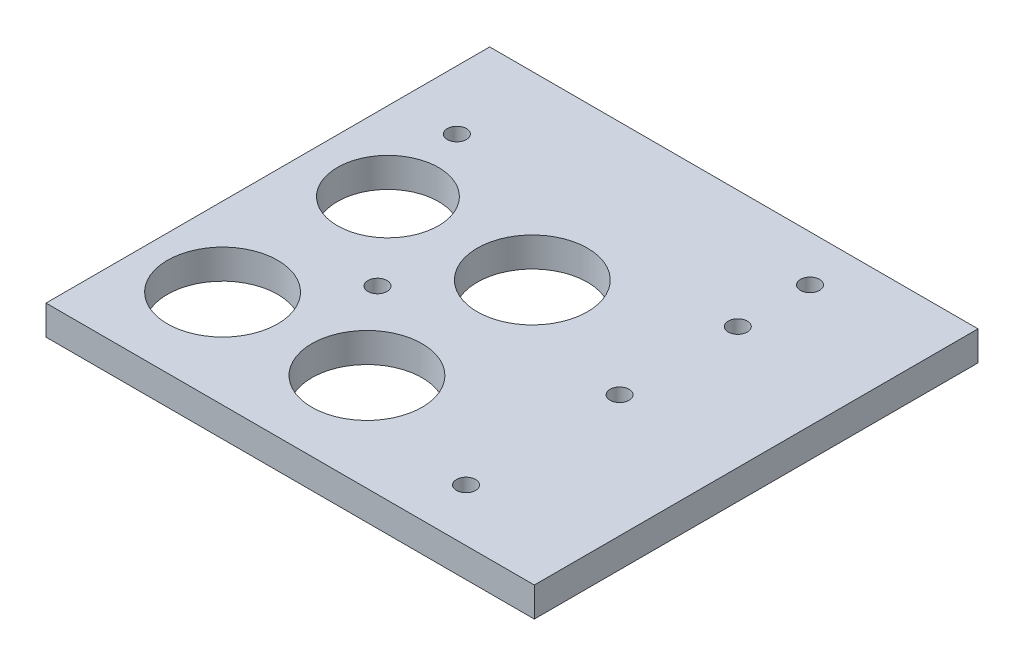
ISO-10303-21;
HEADER;
FILE_DESCRIPTION(('STEP AP214'),'2;1');
FILE_NAME('part.step','',(''),(''),'','','');
FILE_SCHEMA(('AUTOMOTIVE_DESIGN { 1 0 10303 214 1 1 1 1 }'));
ENDSEC;
DATA;
#1=APPLICATION_CONTEXT('core data for automotive mechanical design processes');
#2=APPLICATION_PROTOCOL_DEFINITION('international standard','automotive_design',2000,#1);
#3=PRODUCT_CONTEXT('',#1,'mechanical');
#4=PRODUCT('Part','Part','',(#3));
#5=PRODUCT_RELATED_PRODUCT_CATEGORY('part','',(#4));
#6=PRODUCT_DEFINITION_FORMATION('','',#4);
#7=PRODUCT_DEFINITION_CONTEXT('part definition',#1,'design');
#8=PRODUCT_DEFINITION('design','',#6,#7);
#9=PRODUCT_DEFINITION_SHAPE('','',#8);
#10=(LENGTH_UNIT() NAMED_UNIT(*) SI_UNIT(.MILLI.,.METRE.));
#11=(NAMED_UNIT(*) PLANE_ANGLE_UNIT() SI_UNIT($,.RADIAN.));
#12=(NAMED_UNIT(*) SI_UNIT($,.STERADIAN.) SOLID_ANGLE_UNIT());
#13=UNCERTAINTY_MEASURE_WITH_UNIT(LENGTH_MEASURE(1.E-05),#10,'distance_accuracy_value','');
#14=(GEOMETRIC_REPRESENTATION_CONTEXT(3) GLOBAL_UNCERTAINTY_ASSIGNED_CONTEXT((#13)) GLOBAL_UNIT_ASSIGNED_CONTEXT((#10,
#11,#12)) REPRESENTATION_CONTEXT('',''));
#15=CARTESIAN_POINT('',(0.,0.,0.));
#16=DIRECTION('',(0.,0.,1.));
#17=DIRECTION('',(1.,0.,0.));
#18=AXIS2_PLACEMENT_3D('',#15,#16,#17);
#19=CARTESIAN_POINT('',(0.,5.715,0.));
#20=DIRECTION('',(0.,1.,0.));
#21=DIRECTION('',(0.,0.,1.));
#22=AXIS2_PLACEMENT_3D('',#19,#20,#21);
#23=PLANE('',#22);
#24=CARTESIAN_POINT('',(41.656,5.715,-42.037));
#25=DIRECTION('',(0.,1.,0.));
#26=DIRECTION('',(0.,0.,1.));
#27=AXIS2_PLACEMENT_3D('',#24,#25,#26);
#28=CIRCLE('',#27,1.85);
#29=CARTESIAN_POINT('',(41.656,5.715,-40.187));
#30=VERTEX_POINT('',#29);
#31=EDGE_CURVE('E132',#30,#30,#28,.T.);
#32=ORIENTED_EDGE('',*,*,#31,.F.);
#33=EDGE_LOOP('',(#32));
#34=FACE_BOUND('',#33,.T.);
#35=CARTESIAN_POINT('',(41.91,5.715,24.765));
#36=DIRECTION('',(0.,1.,0.));
#37=DIRECTION('',(0.,0.,1.));
#38=AXIS2_PLACEMENT_3D('',#35,#36,#37);
#39=CIRCLE('',#38,1.85);
#40=CARTESIAN_POINT('',(41.91,5.715,26.615));
#41=VERTEX_POINT('',#40);
#42=EDGE_CURVE('E121',#41,#41,#39,.T.);
#43=ORIENTED_EDGE('',*,*,#42,.F.);
#44=EDGE_LOOP('',(#43));
#45=FACE_BOUND('',#44,.T.);
#46=CARTESIAN_POINT('',(-17.78,5.715,-33.147));
#47=DIRECTION('',(0.,1.,0.));
#48=DIRECTION('',(0.,0.,1.));
#49=AXIS2_PLACEMENT_3D('',#46,#47,#48);
#50=CIRCLE('',#49,1.85);
#51=CARTESIAN_POINT('',(-17.78,5.715,-31.297));
#52=VERTEX_POINT('',#51);
#53=EDGE_CURVE('E120',#52,#52,#50,.T.);
#54=ORIENTED_EDGE('',*,*,#53,.F.);
#55=EDGE_LOOP('',(#54));
#56=FACE_BOUND('',#55,.T.);
#57=CARTESIAN_POINT('',(41.656,5.715,-5.207));
#58=DIRECTION('',(0.,1.,0.));
#59=DIRECTION('',(0.,0.,1.));
#60=AXIS2_PLACEMENT_3D('',#57,#58,#59);
#61=CIRCLE('',#60,1.85);
#62=CARTESIAN_POINT('',(41.656,5.715,-3.35700000000001));
#63=VERTEX_POINT('',#62);
#64=EDGE_CURVE('E117',#63,#63,#61,.T.);
#65=ORIENTED_EDGE('',*,*,#64,.F.);
#66=EDGE_LOOP('',(#65));
#67=FACE_BOUND('',#66,.T.);
#68=CARTESIAN_POINT('',(41.656,5.715,-28.067));
#69=DIRECTION('',(0.,1.,0.));
#70=DIRECTION('',(0.,0.,1.));
#71=AXIS2_PLACEMENT_3D('',#68,#69,#70);
#72=CIRCLE('',#71,1.85);
#73=CARTESIAN_POINT('',(41.656,5.715,-26.217));
#74=VERTEX_POINT('',#73);
#75=EDGE_CURVE('E114',#74,#74,#72,.T.);
#76=ORIENTED_EDGE('',*,*,#75,.F.);
#77=EDGE_LOOP('',(#76));
#78=FACE_BOUND('',#77,.T.);
#79=CARTESIAN_POINT('',(0.,5.715,0.));
#80=DIRECTION('',(0.,1.,0.));
#81=DIRECTION('',(0.,0.,1.));
#82=AXIS2_PLACEMENT_3D('',#79,#80,#81);
#83=CIRCLE('',#82,1.85);
#84=CARTESIAN_POINT('',(0.,5.715,1.85));
#85=VERTEX_POINT('',#84);
#86=EDGE_CURVE('E113',#85,#85,#83,.T.);
#87=ORIENTED_EDGE('',*,*,#86,.F.);
#88=EDGE_LOOP('',(#87));
#89=FACE_BOUND('',#88,.T.);
#90=CARTESIAN_POINT('',(13.9699999999999,5.715,16.002));
#91=DIRECTION('',(0.,1.,0.));
#92=DIRECTION('',(0.,0.,1.));
#93=AXIS2_PLACEMENT_3D('',#90,#91,#92);
#94=CIRCLE('',#93,10.668);
#95=CARTESIAN_POINT('',(13.9699999999999,5.715,26.67));
#96=VERTEX_POINT('',#95);
#97=EDGE_CURVE('E153',#96,#96,#94,.T.);
#98=ORIENTED_EDGE('',*,*,#97,.F.);
#99=EDGE_LOOP('',(#98));
#100=FACE_BOUND('',#99,.T.);
#101=CARTESIAN_POINT('',(-13.97,5.715,-16.002));
#102=DIRECTION('',(0.,1.,0.));
#103=DIRECTION('',(0.,0.,1.));
#104=AXIS2_PLACEMENT_3D('',#101,#102,#103);
#105=CIRCLE('',#104,9.779);
#106=CARTESIAN_POINT('',(-13.97,5.715,-6.223));
#107=VERTEX_POINT('',#106);
#108=EDGE_CURVE('E104',#107,#107,#105,.T.);
#109=ORIENTED_EDGE('',*,*,#108,.F.);
#110=EDGE_LOOP('',(#109));
#111=FACE_BOUND('',#110,.T.);
#112=DIRECTION('',(0.,0.,-1.));
#113=VECTOR('',#112,1.);
#114=CARTESIAN_POINT('',(65.278,5.715,-50.927));
#115=LINE('',#114,#113);
#116=CARTESIAN_POINT('',(65.278,5.715,34.925));
#117=VERTEX_POINT('',#116);
#118=CARTESIAN_POINT('',(65.278,5.715,-50.927));
#119=VERTEX_POINT('',#118);
#120=EDGE_CURVE('E88',#117,#119,#115,.T.);
#121=ORIENTED_EDGE('',*,*,#120,.T.);
#122=DIRECTION('',(-1.,0.,0.));
#123=VECTOR('',#122,1.);
#124=CARTESIAN_POINT('',(-29.21,5.715,-50.927));
#125=LINE('',#124,#123);
#126=CARTESIAN_POINT('',(-29.21,5.715,-50.927));
#127=VERTEX_POINT('',#126);
#128=EDGE_CURVE('E83',#119,#127,#125,.T.);
#129=ORIENTED_EDGE('',*,*,#128,.T.);
#130=DIRECTION('',(0.,0.,1.));
#131=VECTOR('',#130,1.);
#132=CARTESIAN_POINT('',(-29.21,5.715,-50.927));
#133=LINE('',#132,#131);
#134=CARTESIAN_POINT('',(-29.21,5.715,34.925));
#135=VERTEX_POINT('',#134);
#136=EDGE_CURVE('E86',#127,#135,#133,.T.);
#137=ORIENTED_EDGE('',*,*,#136,.T.);
#138=DIRECTION('',(1.,0.,0.));
#139=VECTOR('',#138,1.);
#140=CARTESIAN_POINT('',(-29.21,5.715,34.925));
#141=LINE('',#140,#139);
#142=EDGE_CURVE('E53',#135,#117,#141,.T.);
#143=ORIENTED_EDGE('',*,*,#142,.T.);
#144=EDGE_LOOP('',(#121,#129,#137,#143));
#145=FACE_BOUND('',#144,.T.);
#146=CARTESIAN_POINT('',(13.9699999999999,5.715,-16.002));
#147=DIRECTION('',(0.,1.,0.));
#148=DIRECTION('',(0.,0.,-1.));
#149=AXIS2_PLACEMENT_3D('',#146,#147,#148);
#150=CIRCLE('',#149,10.668);
#151=CARTESIAN_POINT('',(13.9699999999999,5.715,-26.67));
#152=VERTEX_POINT('',#151);
#153=EDGE_CURVE('E159',#152,#152,#150,.T.);
#154=ORIENTED_EDGE('',*,*,#153,.F.);
#155=EDGE_LOOP('',(#154));
#156=FACE_BOUND('',#155,.T.);
#157=CARTESIAN_POINT('',(-13.97,5.715,16.002));
#158=DIRECTION('',(0.,1.,0.));
#159=DIRECTION('',(0.,0.,-1.));
#160=AXIS2_PLACEMENT_3D('',#157,#158,#159);
#161=CIRCLE('',#160,10.668);
#162=CARTESIAN_POINT('',(-13.97,5.715,5.334));
#163=VERTEX_POINT('',#162);
#164=EDGE_CURVE('E147',#163,#163,#161,.T.);
#165=ORIENTED_EDGE('',*,*,#164,.F.);
#166=EDGE_LOOP('',(#165));
#167=FACE_BOUND('',#166,.T.);
#168=ADVANCED_FACE('F34',(#34,#45,#56,#67,#78,#89,#100,#111,#145,#156,#167),#23,.T.);
#169=CARTESIAN_POINT('',(0.,0.,0.));
#170=DIRECTION('',(0.,1.,0.));
#171=DIRECTION('',(0.,0.,1.));
#172=AXIS2_PLACEMENT_3D('',#169,#170,#171);
#173=PLANE('',#172);
#174=CARTESIAN_POINT('',(41.656,0.,-42.037));
#175=DIRECTION('',(0.,1.,0.));
#176=DIRECTION('',(0.,0.,1.));
#177=AXIS2_PLACEMENT_3D('',#174,#175,#176);
#178=CIRCLE('',#177,1.84999999999999);
#179=CARTESIAN_POINT('',(41.656,0.,-40.187));
#180=VERTEX_POINT('',#179);
#181=EDGE_CURVE('E38',#180,#180,#178,.T.);
#182=ORIENTED_EDGE('',*,*,#181,.T.);
#183=EDGE_LOOP('',(#182));
#184=FACE_BOUND('',#183,.T.);
#185=CARTESIAN_POINT('',(41.91,0.,24.765));
#186=DIRECTION('',(0.,1.,0.));
#187=DIRECTION('',(0.,0.,1.));
#188=AXIS2_PLACEMENT_3D('',#185,#186,#187);
#189=CIRCLE('',#188,1.84999999999999);
#190=CARTESIAN_POINT('',(41.91,0.,26.615));
#191=VERTEX_POINT('',#190);
#192=EDGE_CURVE('E118',#191,#191,#189,.T.);
#193=ORIENTED_EDGE('',*,*,#192,.T.);
#194=EDGE_LOOP('',(#193));
#195=FACE_BOUND('',#194,.T.);
#196=CARTESIAN_POINT('',(-17.78,0.,-33.147));
#197=DIRECTION('',(0.,1.,0.));
#198=DIRECTION('',(0.,0.,1.));
#199=AXIS2_PLACEMENT_3D('',#196,#197,#198);
#200=CIRCLE('',#199,1.85);
#201=CARTESIAN_POINT('',(-17.78,0.,-31.297));
#202=VERTEX_POINT('',#201);
#203=EDGE_CURVE('E125',#202,#202,#200,.T.);
#204=ORIENTED_EDGE('',*,*,#203,.T.);
#205=EDGE_LOOP('',(#204));
#206=FACE_BOUND('',#205,.T.);
#207=CARTESIAN_POINT('',(41.656,0.,-5.207));
#208=DIRECTION('',(0.,1.,0.));
#209=DIRECTION('',(0.,0.,1.));
#210=AXIS2_PLACEMENT_3D('',#207,#208,#209);
#211=CIRCLE('',#210,1.84999999999999);
#212=CARTESIAN_POINT('',(41.656,0.,-3.35700000000001));
#213=VERTEX_POINT('',#212);
#214=EDGE_CURVE('E115',#213,#213,#211,.T.);
#215=ORIENTED_EDGE('',*,*,#214,.T.);
#216=EDGE_LOOP('',(#215));
#217=FACE_BOUND('',#216,.T.);
#218=CARTESIAN_POINT('',(41.656,0.,-28.067));
#219=DIRECTION('',(0.,1.,0.));
#220=DIRECTION('',(0.,0.,1.));
#221=AXIS2_PLACEMENT_3D('',#218,#219,#220);
#222=CIRCLE('',#221,1.84999999999999);
#223=CARTESIAN_POINT('',(41.656,0.,-26.217));
#224=VERTEX_POINT('',#223);
#225=EDGE_CURVE('E110',#224,#224,#222,.T.);
#226=ORIENTED_EDGE('',*,*,#225,.T.);
#227=EDGE_LOOP('',(#226));
#228=FACE_BOUND('',#227,.T.);
#229=CARTESIAN_POINT('',(0.,0.,0.));
#230=DIRECTION('',(0.,1.,0.));
#231=DIRECTION('',(0.,0.,1.));
#232=AXIS2_PLACEMENT_3D('',#229,#230,#231);
#233=CIRCLE('',#232,1.85);
#234=CARTESIAN_POINT('',(0.,0.,1.85));
#235=VERTEX_POINT('',#234);
#236=EDGE_CURVE('E143',#235,#235,#233,.T.);
#237=ORIENTED_EDGE('',*,*,#236,.T.);
#238=EDGE_LOOP('',(#237));
#239=FACE_BOUND('',#238,.T.);
#240=DIRECTION('',(0.,0.,-1.));
#241=VECTOR('',#240,1.);
#242=CARTESIAN_POINT('',(65.278,0.,-50.927));
#243=LINE('',#242,#241);
#244=CARTESIAN_POINT('',(65.278,0.,34.925));
#245=VERTEX_POINT('',#244);
#246=CARTESIAN_POINT('',(65.278,0.,-50.927));
#247=VERTEX_POINT('',#246);
#248=EDGE_CURVE('E101',#245,#247,#243,.T.);
#249=ORIENTED_EDGE('',*,*,#248,.F.);
#250=DIRECTION('',(1.,0.,0.));
#251=VECTOR('',#250,1.);
#252=CARTESIAN_POINT('',(-29.21,0.,34.925));
#253=LINE('',#252,#251);
#254=CARTESIAN_POINT('',(-29.21,0.,34.925));
#255=VERTEX_POINT('',#254);
#256=EDGE_CURVE('E76',#255,#245,#253,.T.);
#257=ORIENTED_EDGE('',*,*,#256,.F.);
#258=DIRECTION('',(0.,0.,1.));
#259=VECTOR('',#258,1.);
#260=CARTESIAN_POINT('',(-29.21,0.,-50.927));
#261=LINE('',#260,#259);
#262=CARTESIAN_POINT('',(-29.21,0.,-50.927));
#263=VERTEX_POINT('',#262);
#264=EDGE_CURVE('E70',#263,#255,#261,.T.);
#265=ORIENTED_EDGE('',*,*,#264,.F.);
#266=DIRECTION('',(-1.,0.,0.));
#267=VECTOR('',#266,1.);
#268=CARTESIAN_POINT('',(-29.21,0.,-50.927));
#269=LINE('',#268,#267);
#270=EDGE_CURVE('E92',#247,#263,#269,.T.);
#271=ORIENTED_EDGE('',*,*,#270,.F.);
#272=EDGE_LOOP('',(#249,#257,#265,#271));
#273=FACE_BOUND('',#272,.T.);
#274=CARTESIAN_POINT('',(-13.97,0.,-16.002));
#275=DIRECTION('',(0.,1.,0.));
#276=DIRECTION('',(0.,0.,1.));
#277=AXIS2_PLACEMENT_3D('',#274,#275,#276);
#278=CIRCLE('',#277,9.779);
#279=CARTESIAN_POINT('',(-13.97,0.,-6.223));
#280=VERTEX_POINT('',#279);
#281=EDGE_CURVE('E162',#280,#280,#278,.T.);
#282=ORIENTED_EDGE('',*,*,#281,.T.);
#283=EDGE_LOOP('',(#282));
#284=FACE_BOUND('',#283,.T.);
#285=CARTESIAN_POINT('',(13.9699999999999,0.,-16.002));
#286=DIRECTION('',(0.,1.,0.));
#287=DIRECTION('',(0.,0.,-1.));
#288=AXIS2_PLACEMENT_3D('',#285,#286,#287);
#289=CIRCLE('',#288,10.668);
#290=CARTESIAN_POINT('',(13.9699999999999,0.,-26.67));
#291=VERTEX_POINT('',#290);
#292=EDGE_CURVE('E156',#291,#291,#289,.T.);
#293=ORIENTED_EDGE('',*,*,#292,.T.);
#294=EDGE_LOOP('',(#293));
#295=FACE_BOUND('',#294,.T.);
#296=CARTESIAN_POINT('',(13.9699999999999,0.,16.002));
#297=DIRECTION('',(0.,1.,0.));
#298=DIRECTION('',(0.,0.,1.));
#299=AXIS2_PLACEMENT_3D('',#296,#297,#298);
#300=CIRCLE('',#299,10.668);
#301=CARTESIAN_POINT('',(13.9699999999999,0.,26.67));
#302=VERTEX_POINT('',#301);
#303=EDGE_CURVE('E150',#302,#302,#300,.T.);
#304=ORIENTED_EDGE('',*,*,#303,.T.);
#305=EDGE_LOOP('',(#304));
#306=FACE_BOUND('',#305,.T.);
#307=CARTESIAN_POINT('',(-13.97,0.,16.002));
#308=DIRECTION('',(0.,1.,0.));
#309=DIRECTION('',(0.,0.,-1.));
#310=AXIS2_PLACEMENT_3D('',#307,#308,#309);
#311=CIRCLE('',#310,10.668);
#312=CARTESIAN_POINT('',(-13.97,0.,5.334));
#313=VERTEX_POINT('',#312);
#314=EDGE_CURVE('E146',#313,#313,#311,.T.);
#315=ORIENTED_EDGE('',*,*,#314,.T.);
#316=EDGE_LOOP('',(#315));
#317=FACE_BOUND('',#316,.T.);
#318=ADVANCED_FACE('F170',(#184,#195,#206,#217,#228,#239,#273,#284,#295,#306,#317),#173,.F.);
#319=CARTESIAN_POINT('',(65.278,5.715,-50.927));
#320=DIRECTION('',(-1.,0.,0.));
#321=DIRECTION('',(0.,0.,1.));
#322=AXIS2_PLACEMENT_3D('',#319,#320,#321);
#323=PLANE('',#322);
#324=ORIENTED_EDGE('',*,*,#248,.T.);
#325=DIRECTION('',(0.,-1.,0.));
#326=VECTOR('',#325,1.);
#327=CARTESIAN_POINT('',(65.278,5.715,-50.927));
#328=LINE('',#327,#326);
#329=EDGE_CURVE('E11',#119,#247,#328,.T.);
#330=ORIENTED_EDGE('',*,*,#329,.F.);
#331=ORIENTED_EDGE('',*,*,#120,.F.);
#332=DIRECTION('',(0.,-1.,0.));
#333=VECTOR('',#332,1.);
#334=CARTESIAN_POINT('',(65.278,5.715,34.925));
#335=LINE('',#334,#333);
#336=EDGE_CURVE('E97',#117,#245,#335,.T.);
#337=ORIENTED_EDGE('',*,*,#336,.T.);
#338=EDGE_LOOP('',(#324,#330,#331,#337));
#339=FACE_BOUND('',#338,.T.);
#340=ADVANCED_FACE('F36',(#339),#323,.F.);
#341=CARTESIAN_POINT('',(-29.21,5.715,-50.927));
#342=DIRECTION('',(0.,0.,1.));
#343=DIRECTION('',(1.,0.,0.));
#344=AXIS2_PLACEMENT_3D('',#341,#342,#343);
#345=PLANE('',#344);
#346=ORIENTED_EDGE('',*,*,#270,.T.);
#347=DIRECTION('',(0.,-1.,0.));
#348=VECTOR('',#347,1.);
#349=CARTESIAN_POINT('',(-29.21,5.715,-50.927));
#350=LINE('',#349,#348);
#351=EDGE_CURVE('E44',#127,#263,#350,.T.);
#352=ORIENTED_EDGE('',*,*,#351,.F.);
#353=ORIENTED_EDGE('',*,*,#128,.F.);
#354=ORIENTED_EDGE('',*,*,#329,.T.);
#355=EDGE_LOOP('',(#346,#352,#353,#354));
#356=FACE_BOUND('',#355,.T.);
#357=ADVANCED_FACE('F91',(#356),#345,.F.);
#358=CARTESIAN_POINT('',(-29.21,5.715,-50.927));
#359=DIRECTION('',(1.,0.,0.));
#360=DIRECTION('',(0.,0.,-1.));
#361=AXIS2_PLACEMENT_3D('',#358,#359,#360);
#362=PLANE('',#361);
#363=ORIENTED_EDGE('',*,*,#264,.T.);
#364=DIRECTION('',(0.,-1.,0.));
#365=VECTOR('',#364,1.);
#366=CARTESIAN_POINT('',(-29.21,5.715,34.925));
#367=LINE('',#366,#365);
#368=EDGE_CURVE('E93',#135,#255,#367,.T.);
#369=ORIENTED_EDGE('',*,*,#368,.F.);
#370=ORIENTED_EDGE('',*,*,#136,.F.);
#371=ORIENTED_EDGE('',*,*,#351,.T.);
#372=EDGE_LOOP('',(#363,#369,#370,#371));
#373=FACE_BOUND('',#372,.T.);
#374=ADVANCED_FACE('F95',(#373),#362,.F.);
#375=CARTESIAN_POINT('',(-29.21,5.715,34.925));
#376=DIRECTION('',(0.,0.,-1.));
#377=DIRECTION('',(-1.,0.,0.));
#378=AXIS2_PLACEMENT_3D('',#375,#376,#377);
#379=PLANE('',#378);
#380=ORIENTED_EDGE('',*,*,#256,.T.);
#381=ORIENTED_EDGE('',*,*,#336,.F.);
#382=ORIENTED_EDGE('',*,*,#142,.F.);
#383=ORIENTED_EDGE('',*,*,#368,.T.);
#384=EDGE_LOOP('',(#380,#381,#382,#383));
#385=FACE_BOUND('',#384,.T.);
#386=ADVANCED_FACE('F176',(#385),#379,.F.);
#387=CARTESIAN_POINT('',(-13.97,5.715,-16.002));
#388=DIRECTION('',(0.,-1.,0.));
#389=DIRECTION('',(0.,0.,-1.));
#390=AXIS2_PLACEMENT_3D('',#387,#388,#389);
#391=CYLINDRICAL_SURFACE('',#390,9.779);
#392=ORIENTED_EDGE('',*,*,#108,.T.);
#393=EDGE_LOOP('',(#392));
#394=FACE_BOUND('',#393,.T.);
#395=ORIENTED_EDGE('',*,*,#281,.F.);
#396=EDGE_LOOP('',(#395));
#397=FACE_BOUND('',#396,.T.);
#398=ADVANCED_FACE('F173',(#394,#397),#391,.F.);
#399=CARTESIAN_POINT('',(13.9699999999999,5.715,-16.002));
#400=DIRECTION('',(0.,-1.,0.));
#401=DIRECTION('',(0.,0.,-1.));
#402=AXIS2_PLACEMENT_3D('',#399,#400,#401);
#403=CYLINDRICAL_SURFACE('',#402,10.668);
#404=ORIENTED_EDGE('',*,*,#153,.T.);
#405=EDGE_LOOP('',(#404));
#406=FACE_BOUND('',#405,.T.);
#407=ORIENTED_EDGE('',*,*,#292,.F.);
#408=EDGE_LOOP('',(#407));
#409=FACE_BOUND('',#408,.T.);
#410=ADVANCED_FACE('F175',(#406,#409),#403,.F.);
#411=CARTESIAN_POINT('',(13.9699999999999,5.715,16.002));
#412=DIRECTION('',(0.,-1.,0.));
#413=DIRECTION('',(0.,0.,-1.));
#414=AXIS2_PLACEMENT_3D('',#411,#412,#413);
#415=CYLINDRICAL_SURFACE('',#414,10.668);
#416=ORIENTED_EDGE('',*,*,#97,.T.);
#417=EDGE_LOOP('',(#416));
#418=FACE_BOUND('',#417,.T.);
#419=ORIENTED_EDGE('',*,*,#303,.F.);
#420=EDGE_LOOP('',(#419));
#421=FACE_BOUND('',#420,.T.);
#422=ADVANCED_FACE('F183',(#418,#421),#415,.F.);
#423=CARTESIAN_POINT('',(-13.97,5.715,16.002));
#424=DIRECTION('',(0.,-1.,0.));
#425=DIRECTION('',(0.,0.,-1.));
#426=AXIS2_PLACEMENT_3D('',#423,#424,#425);
#427=CYLINDRICAL_SURFACE('',#426,10.668);
#428=ORIENTED_EDGE('',*,*,#164,.T.);
#429=EDGE_LOOP('',(#428));
#430=FACE_BOUND('',#429,.T.);
#431=ORIENTED_EDGE('',*,*,#314,.F.);
#432=EDGE_LOOP('',(#431));
#433=FACE_BOUND('',#432,.T.);
#434=ADVANCED_FACE('F226',(#430,#433),#427,.F.);
#435=CARTESIAN_POINT('',(0.,5.715,0.));
#436=DIRECTION('',(0.,1.,0.));
#437=DIRECTION('',(0.,0.,1.));
#438=AXIS2_PLACEMENT_3D('',#435,#436,#437);
#439=CYLINDRICAL_SURFACE('',#438,1.85);
#440=ORIENTED_EDGE('',*,*,#86,.T.);
#441=EDGE_LOOP('',(#440));
#442=FACE_BOUND('',#441,.T.);
#443=ORIENTED_EDGE('',*,*,#236,.F.);
#444=EDGE_LOOP('',(#443));
#445=FACE_BOUND('',#444,.T.);
#446=ADVANCED_FACE('F220',(#442,#445),#439,.F.);
#447=CARTESIAN_POINT('',(41.656,5.715,-28.067));
#448=DIRECTION('',(0.,1.,0.));
#449=DIRECTION('',(0.,0.,1.));
#450=AXIS2_PLACEMENT_3D('',#447,#448,#449);
#451=CYLINDRICAL_SURFACE('',#450,1.84999999999999);
#452=ORIENTED_EDGE('',*,*,#75,.T.);
#453=EDGE_LOOP('',(#452));
#454=FACE_BOUND('',#453,.T.);
#455=ORIENTED_EDGE('',*,*,#225,.F.);
#456=EDGE_LOOP('',(#455));
#457=FACE_BOUND('',#456,.T.);
#458=ADVANCED_FACE('F225',(#454,#457),#451,.F.);
#459=CARTESIAN_POINT('',(41.656,5.715,-5.207));
#460=DIRECTION('',(0.,1.,0.));
#461=DIRECTION('',(0.,0.,1.));
#462=AXIS2_PLACEMENT_3D('',#459,#460,#461);
#463=CYLINDRICAL_SURFACE('',#462,1.84999999999999);
#464=ORIENTED_EDGE('',*,*,#64,.T.);
#465=EDGE_LOOP('',(#464));
#466=FACE_BOUND('',#465,.T.);
#467=ORIENTED_EDGE('',*,*,#214,.F.);
#468=EDGE_LOOP('',(#467));
#469=FACE_BOUND('',#468,.T.);
#470=ADVANCED_FACE('F238',(#466,#469),#463,.F.);
#471=CARTESIAN_POINT('',(-17.78,5.715,-33.147));
#472=DIRECTION('',(0.,1.,0.));
#473=DIRECTION('',(0.,0.,1.));
#474=AXIS2_PLACEMENT_3D('',#471,#472,#473);
#475=CYLINDRICAL_SURFACE('',#474,1.85);
#476=ORIENTED_EDGE('',*,*,#53,.T.);
#477=EDGE_LOOP('',(#476));
#478=FACE_BOUND('',#477,.T.);
#479=ORIENTED_EDGE('',*,*,#203,.F.);
#480=EDGE_LOOP('',(#479));
#481=FACE_BOUND('',#480,.T.);
#482=ADVANCED_FACE('F248',(#478,#481),#475,.F.);
#483=CARTESIAN_POINT('',(41.91,5.715,24.765));
#484=DIRECTION('',(0.,1.,0.));
#485=DIRECTION('',(0.,0.,1.));
#486=AXIS2_PLACEMENT_3D('',#483,#484,#485);
#487=CYLINDRICAL_SURFACE('',#486,1.84999999999999);
#488=ORIENTED_EDGE('',*,*,#42,.T.);
#489=EDGE_LOOP('',(#488));
#490=FACE_BOUND('',#489,.T.);
#491=ORIENTED_EDGE('',*,*,#192,.F.);
#492=EDGE_LOOP('',(#491));
#493=FACE_BOUND('',#492,.T.);
#494=ADVANCED_FACE('F258',(#490,#493),#487,.F.);
#495=CARTESIAN_POINT('',(41.656,5.715,-42.037));
#496=DIRECTION('',(0.,1.,0.));
#497=DIRECTION('',(0.,0.,1.));
#498=AXIS2_PLACEMENT_3D('',#495,#496,#497);
#499=CYLINDRICAL_SURFACE('',#498,1.84999999999999);
#500=ORIENTED_EDGE('',*,*,#31,.T.);
#501=EDGE_LOOP('',(#500));
#502=FACE_BOUND('',#501,.T.);
#503=ORIENTED_EDGE('',*,*,#181,.F.);
#504=EDGE_LOOP('',(#503));
#505=FACE_BOUND('',#504,.T.);
#506=ADVANCED_FACE('F268',(#502,#505),#499,.F.);
#507=CLOSED_SHELL('',(#168,#318,#340,#357,#374,#386,#398,#410,#422,#434,#446,#458,#470,#482,
#494,#506));
#508=MANIFOLD_SOLID_BREP('B2',#507);
#509=ADVANCED_BREP_SHAPE_REPRESENTATION('',(#18,#508),#14);
#510=SHAPE_DEFINITION_REPRESENTATION(#9,#509);
ENDSEC;
END-ISO-10303-21;
